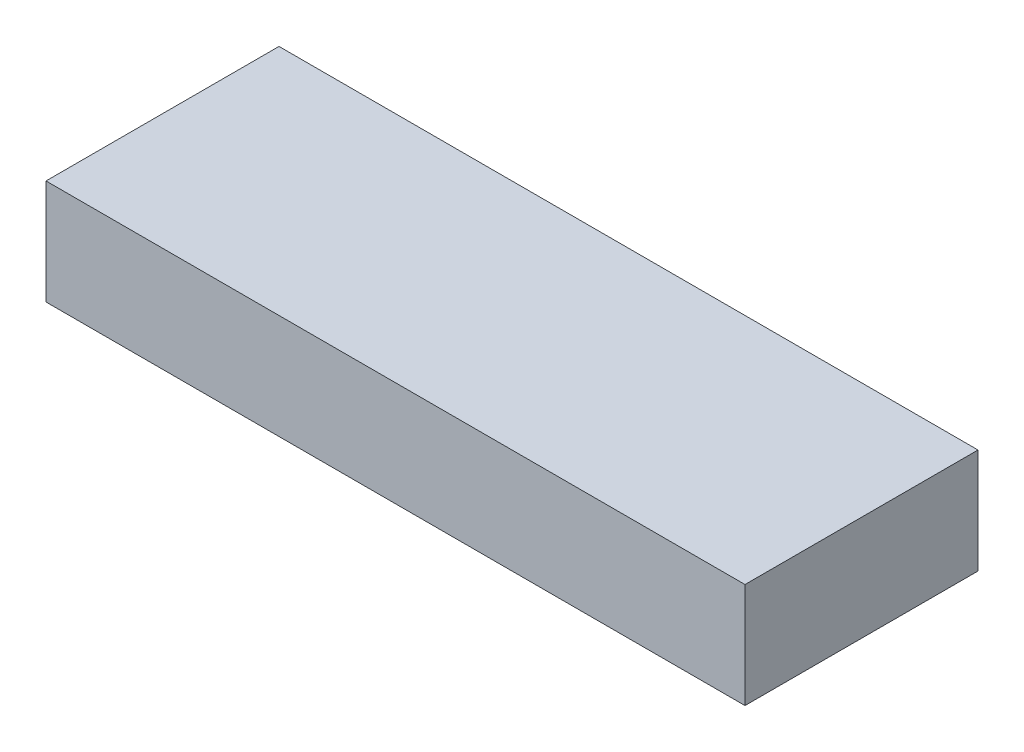
ISO-10303-21;
HEADER;
FILE_DESCRIPTION(('STEP AP214'),'2;1');
FILE_NAME('part.step','',(''),(''),'','','');
FILE_SCHEMA(('AUTOMOTIVE_DESIGN { 1 0 10303 214 1 1 1 1 }'));
ENDSEC;
DATA;
#1=APPLICATION_CONTEXT('core data for automotive mechanical design processes');
#2=APPLICATION_PROTOCOL_DEFINITION('international standard','automotive_design',2000,#1);
#3=PRODUCT_CONTEXT('',#1,'mechanical');
#4=PRODUCT('Part','Part','',(#3));
#5=PRODUCT_RELATED_PRODUCT_CATEGORY('part','',(#4));
#6=PRODUCT_DEFINITION_FORMATION('','',#4);
#7=PRODUCT_DEFINITION_CONTEXT('part definition',#1,'design');
#8=PRODUCT_DEFINITION('design','',#6,#7);
#9=PRODUCT_DEFINITION_SHAPE('','',#8);
#10=(LENGTH_UNIT() NAMED_UNIT(*) SI_UNIT(.MILLI.,.METRE.));
#11=(NAMED_UNIT(*) PLANE_ANGLE_UNIT() SI_UNIT($,.RADIAN.));
#12=(NAMED_UNIT(*) SI_UNIT($,.STERADIAN.) SOLID_ANGLE_UNIT());
#13=UNCERTAINTY_MEASURE_WITH_UNIT(LENGTH_MEASURE(1.E-05),#10,'distance_accuracy_value','');
#14=(GEOMETRIC_REPRESENTATION_CONTEXT(3) GLOBAL_UNCERTAINTY_ASSIGNED_CONTEXT((#13)) GLOBAL_UNIT_ASSIGNED_CONTEXT((#10,
#11,#12)) REPRESENTATION_CONTEXT('',''));
#15=CARTESIAN_POINT('',(0.,0.,0.));
#16=DIRECTION('',(0.,0.,1.));
#17=DIRECTION('',(1.,0.,0.));
#18=AXIS2_PLACEMENT_3D('',#15,#16,#17);
#19=CARTESIAN_POINT('',(0.,2.286,0.));
#20=DIRECTION('',(-1.,0.,0.));
#21=DIRECTION('',(0.,0.,1.));
#22=AXIS2_PLACEMENT_3D('',#19,#20,#21);
#23=PLANE('',#22);
#24=DIRECTION('',(0.,0.,-1.));
#25=VECTOR('',#24,1.);
#26=CARTESIAN_POINT('',(0.,0.,0.));
#27=LINE('',#26,#25);
#28=CARTESIAN_POINT('',(0.,0.,0.));
#29=VERTEX_POINT('',#28);
#30=CARTESIAN_POINT('',(0.,0.,-5.08));
#31=VERTEX_POINT('',#30);
#32=EDGE_CURVE('E107',#29,#31,#27,.T.);
#33=ORIENTED_EDGE('',*,*,#32,.T.);
#34=DIRECTION('',(0.,-1.,0.));
#35=VECTOR('',#34,1.);
#36=CARTESIAN_POINT('',(0.,2.286,-5.08));
#37=LINE('',#36,#35);
#38=CARTESIAN_POINT('',(0.,2.286,-5.08));
#39=VERTEX_POINT('',#38);
#40=EDGE_CURVE('E11',#39,#31,#37,.T.);
#41=ORIENTED_EDGE('',*,*,#40,.F.);
#42=DIRECTION('',(0.,0.,-1.));
#43=VECTOR('',#42,1.);
#44=CARTESIAN_POINT('',(0.,2.286,0.));
#45=LINE('',#44,#43);
#46=CARTESIAN_POINT('',(0.,2.286,0.));
#47=VERTEX_POINT('',#46);
#48=EDGE_CURVE('E91',#47,#39,#45,.T.);
#49=ORIENTED_EDGE('',*,*,#48,.F.);
#50=DIRECTION('',(0.,-1.,0.));
#51=VECTOR('',#50,1.);
#52=CARTESIAN_POINT('',(0.,2.286,0.));
#53=LINE('',#52,#51);
#54=EDGE_CURVE('E103',#47,#29,#53,.T.);
#55=ORIENTED_EDGE('',*,*,#54,.T.);
#56=EDGE_LOOP('',(#33,#41,#49,#55));
#57=FACE_BOUND('',#56,.T.);
#58=ADVANCED_FACE('F39',(#57),#23,.F.);
#59=CARTESIAN_POINT('',(0.,2.286,-5.08));
#60=DIRECTION('',(0.,0.,1.));
#61=DIRECTION('',(1.,0.,0.));
#62=AXIS2_PLACEMENT_3D('',#59,#60,#61);
#63=PLANE('',#62);
#64=DIRECTION('',(-1.,0.,0.));
#65=VECTOR('',#64,1.);
#66=CARTESIAN_POINT('',(0.,0.,-5.08));
#67=LINE('',#66,#65);
#68=CARTESIAN_POINT('',(-15.24,0.,-5.08));
#69=VERTEX_POINT('',#68);
#70=EDGE_CURVE('E96',#31,#69,#67,.T.);
#71=ORIENTED_EDGE('',*,*,#70,.T.);
#72=DIRECTION('',(0.,-1.,0.));
#73=VECTOR('',#72,1.);
#74=CARTESIAN_POINT('',(-15.24,2.286,-5.08));
#75=LINE('',#74,#73);
#76=CARTESIAN_POINT('',(-15.24,2.286,-5.08));
#77=VERTEX_POINT('',#76);
#78=EDGE_CURVE('E48',#77,#69,#75,.T.);
#79=ORIENTED_EDGE('',*,*,#78,.F.);
#80=DIRECTION('',(-1.,0.,0.));
#81=VECTOR('',#80,1.);
#82=CARTESIAN_POINT('',(0.,2.286,-5.08));
#83=LINE('',#82,#81);
#84=EDGE_CURVE('E86',#39,#77,#83,.T.);
#85=ORIENTED_EDGE('',*,*,#84,.F.);
#86=ORIENTED_EDGE('',*,*,#40,.T.);
#87=EDGE_LOOP('',(#71,#79,#85,#86));
#88=FACE_BOUND('',#87,.T.);
#89=ADVANCED_FACE('F95',(#88),#63,.F.);
#90=CARTESIAN_POINT('',(-15.24,2.286,0.));
#91=DIRECTION('',(1.,0.,0.));
#92=DIRECTION('',(0.,0.,-1.));
#93=AXIS2_PLACEMENT_3D('',#90,#91,#92);
#94=PLANE('',#93);
#95=DIRECTION('',(0.,0.,1.));
#96=VECTOR('',#95,1.);
#97=CARTESIAN_POINT('',(-15.24,0.,0.));
#98=LINE('',#97,#96);
#99=CARTESIAN_POINT('',(-15.24,0.,0.));
#100=VERTEX_POINT('',#99);
#101=EDGE_CURVE('E73',#69,#100,#98,.T.);
#102=ORIENTED_EDGE('',*,*,#101,.T.);
#103=DIRECTION('',(0.,-1.,0.));
#104=VECTOR('',#103,1.);
#105=CARTESIAN_POINT('',(-15.24,2.286,0.));
#106=LINE('',#105,#104);
#107=CARTESIAN_POINT('',(-15.24,2.286,0.));
#108=VERTEX_POINT('',#107);
#109=EDGE_CURVE('E98',#108,#100,#106,.T.);
#110=ORIENTED_EDGE('',*,*,#109,.F.);
#111=DIRECTION('',(0.,0.,1.));
#112=VECTOR('',#111,1.);
#113=CARTESIAN_POINT('',(-15.24,2.286,0.));
#114=LINE('',#113,#112);
#115=EDGE_CURVE('E89',#77,#108,#114,.T.);
#116=ORIENTED_EDGE('',*,*,#115,.F.);
#117=ORIENTED_EDGE('',*,*,#78,.T.);
#118=EDGE_LOOP('',(#102,#110,#116,#117));
#119=FACE_BOUND('',#118,.T.);
#120=ADVANCED_FACE('F99',(#119),#94,.F.);
#121=CARTESIAN_POINT('',(0.,2.286,0.));
#122=DIRECTION('',(0.,0.,-1.));
#123=DIRECTION('',(-1.,0.,0.));
#124=AXIS2_PLACEMENT_3D('',#121,#122,#123);
#125=PLANE('',#124);
#126=DIRECTION('',(1.,0.,0.));
#127=VECTOR('',#126,1.);
#128=CARTESIAN_POINT('',(0.,0.,0.));
#129=LINE('',#128,#127);
#130=EDGE_CURVE('E79',#100,#29,#129,.T.);
#131=ORIENTED_EDGE('',*,*,#130,.T.);
#132=ORIENTED_EDGE('',*,*,#54,.F.);
#133=DIRECTION('',(1.,0.,0.));
#134=VECTOR('',#133,1.);
#135=CARTESIAN_POINT('',(0.,2.286,0.));
#136=LINE('',#135,#134);
#137=EDGE_CURVE('E56',#108,#47,#136,.T.);
#138=ORIENTED_EDGE('',*,*,#137,.F.);
#139=ORIENTED_EDGE('',*,*,#109,.T.);
#140=EDGE_LOOP('',(#131,#132,#138,#139));
#141=FACE_BOUND('',#140,.T.);
#142=ADVANCED_FACE('F120',(#141),#125,.F.);
#143=CARTESIAN_POINT('',(0.,2.286,0.));
#144=DIRECTION('',(0.,1.,0.));
#145=DIRECTION('',(0.,0.,1.));
#146=AXIS2_PLACEMENT_3D('',#143,#144,#145);
#147=PLANE('',#146);
#148=ORIENTED_EDGE('',*,*,#48,.T.);
#149=ORIENTED_EDGE('',*,*,#84,.T.);
#150=ORIENTED_EDGE('',*,*,#115,.T.);
#151=ORIENTED_EDGE('',*,*,#137,.T.);
#152=EDGE_LOOP('',(#148,#149,#150,#151));
#153=FACE_BOUND('',#152,.T.);
#154=ADVANCED_FACE('F87',(#153),#147,.T.);
#155=CARTESIAN_POINT('',(0.,0.,0.));
#156=DIRECTION('',(0.,1.,0.));
#157=DIRECTION('',(0.,0.,1.));
#158=AXIS2_PLACEMENT_3D('',#155,#156,#157);
#159=PLANE('',#158);
#160=ORIENTED_EDGE('',*,*,#32,.F.);
#161=ORIENTED_EDGE('',*,*,#130,.F.);
#162=ORIENTED_EDGE('',*,*,#101,.F.);
#163=ORIENTED_EDGE('',*,*,#70,.F.);
#164=EDGE_LOOP('',(#160,#161,#162,#163));
#165=FACE_BOUND('',#164,.T.);
#166=ADVANCED_FACE('F123',(#165),#159,.F.);
#167=CLOSED_SHELL('',(#58,#89,#120,#142,#154,#166));
#168=MANIFOLD_SOLID_BREP('B2',#167);
#169=ADVANCED_BREP_SHAPE_REPRESENTATION('',(#18,#168),#14);
#170=SHAPE_DEFINITION_REPRESENTATION(#9,#169);
ENDSEC;
END-ISO-10303-21;
